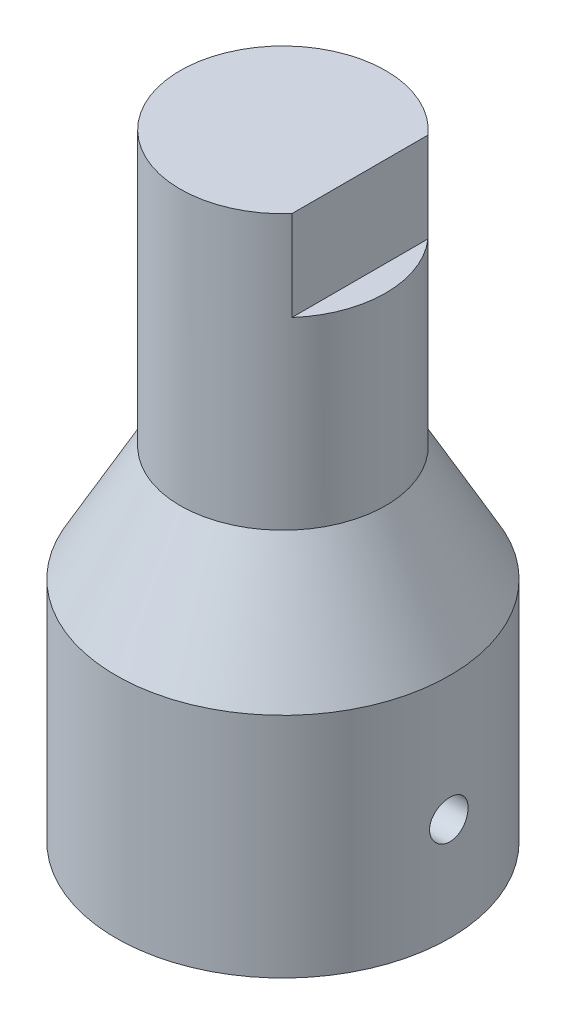
ISO-10303-21;
HEADER;
FILE_DESCRIPTION(('STEP AP214'),'2;1');
FILE_NAME('part.step','',(''),(''),'','','');
FILE_SCHEMA(('AUTOMOTIVE_DESIGN { 1 0 10303 214 1 1 1 1 }'));
ENDSEC;
DATA;
#1=APPLICATION_CONTEXT('core data for automotive mechanical design processes');
#2=APPLICATION_PROTOCOL_DEFINITION('international standard','automotive_design',2000,#1);
#3=PRODUCT_CONTEXT('',#1,'mechanical');
#4=PRODUCT('Part','Part','',(#3));
#5=PRODUCT_RELATED_PRODUCT_CATEGORY('part','',(#4));
#6=PRODUCT_DEFINITION_FORMATION('','',#4);
#7=PRODUCT_DEFINITION_CONTEXT('part definition',#1,'design');
#8=PRODUCT_DEFINITION('design','',#6,#7);
#9=PRODUCT_DEFINITION_SHAPE('','',#8);
#10=(LENGTH_UNIT() NAMED_UNIT(*) SI_UNIT(.MILLI.,.METRE.));
#11=(NAMED_UNIT(*) PLANE_ANGLE_UNIT() SI_UNIT($,.RADIAN.));
#12=(NAMED_UNIT(*) SI_UNIT($,.STERADIAN.) SOLID_ANGLE_UNIT());
#13=UNCERTAINTY_MEASURE_WITH_UNIT(LENGTH_MEASURE(1.E-05),#10,'distance_accuracy_value','');
#14=(GEOMETRIC_REPRESENTATION_CONTEXT(3) GLOBAL_UNCERTAINTY_ASSIGNED_CONTEXT((#13)) GLOBAL_UNIT_ASSIGNED_CONTEXT((#10,
#11,#12)) REPRESENTATION_CONTEXT('',''));
#15=CARTESIAN_POINT('',(0.,0.,0.));
#16=DIRECTION('',(0.,0.,1.));
#17=DIRECTION('',(1.,0.,0.));
#18=AXIS2_PLACEMENT_3D('',#15,#16,#17);
#19=CARTESIAN_POINT('',(0.,38.1,0.));
#20=DIRECTION('',(0.,1.,0.));
#21=DIRECTION('',(0.,0.,1.));
#22=AXIS2_PLACEMENT_3D('',#19,#20,#21);
#23=PLANE('',#22);
#24=CARTESIAN_POINT('',(0.,38.1,0.));
#25=DIRECTION('',(0.,-1.,0.));
#26=DIRECTION('',(0.,0.,-1.));
#27=AXIS2_PLACEMENT_3D('',#24,#25,#26);
#28=CIRCLE('',#27,6.35);
#29=CARTESIAN_POINT('',(4.76,38.1,4.20296324038173));
#30=VERTEX_POINT('',#29);
#31=CARTESIAN_POINT('',(4.76,38.1,-4.20296324038173));
#32=VERTEX_POINT('',#31);
#33=EDGE_CURVE('E48',#30,#32,#28,.T.);
#34=ORIENTED_EDGE('',*,*,#33,.F.);
#35=DIRECTION('',(0.,0.,-1.));
#36=VECTOR('',#35,1.);
#37=CARTESIAN_POINT('',(4.76,38.1,-4.20296324038173));
#38=LINE('',#37,#36);
#39=EDGE_CURVE('E61',#30,#32,#38,.T.);
#40=ORIENTED_EDGE('',*,*,#39,.T.);
#41=EDGE_LOOP('',(#34,#40));
#42=FACE_BOUND('',#41,.T.);
#43=ADVANCED_FACE('F34',(#42),#23,.T.);
#44=CARTESIAN_POINT('',(0.,0.,0.));
#45=DIRECTION('',(0.,-1.,0.));
#46=DIRECTION('',(0.,0.,-1.));
#47=AXIS2_PLACEMENT_3D('',#44,#45,#46);
#48=CYLINDRICAL_SURFACE('',#47,6.35);
#49=CARTESIAN_POINT('',(0.,21.16,0.));
#50=DIRECTION('',(0.,-1.,0.));
#51=DIRECTION('',(0.,0.,-1.));
#52=AXIS2_PLACEMENT_3D('',#49,#50,#51);
#53=CIRCLE('',#52,6.35);
#54=CARTESIAN_POINT('',(0.,21.16,-6.35));
#55=VERTEX_POINT('',#54);
#56=EDGE_CURVE('E79',#55,#55,#53,.T.);
#57=ORIENTED_EDGE('',*,*,#56,.F.);
#58=EDGE_LOOP('',(#57));
#59=FACE_BOUND('',#58,.T.);
#60=CARTESIAN_POINT('',(0.,32.54,0.));
#61=DIRECTION('',(0.,1.,0.));
#62=DIRECTION('',(0.,0.,1.));
#63=AXIS2_PLACEMENT_3D('',#60,#61,#62);
#64=CIRCLE('',#63,6.35);
#65=CARTESIAN_POINT('',(4.76,32.54,-4.20296324038172));
#66=VERTEX_POINT('',#65);
#67=CARTESIAN_POINT('',(4.76,32.54,4.20296324038173));
#68=VERTEX_POINT('',#67);
#69=EDGE_CURVE('E12',#66,#68,#64,.F.);
#70=ORIENTED_EDGE('',*,*,#69,.T.);
#71=DIRECTION('',(0.,1.,0.));
#72=VECTOR('',#71,1.);
#73=CARTESIAN_POINT('',(4.76,32.54,4.20296324038173));
#74=LINE('',#73,#72);
#75=EDGE_CURVE('E72',#68,#30,#74,.T.);
#76=ORIENTED_EDGE('',*,*,#75,.T.);
#77=ORIENTED_EDGE('',*,*,#33,.T.);
#78=DIRECTION('',(0.,1.,0.));
#79=VECTOR('',#78,1.);
#80=CARTESIAN_POINT('',(4.76,32.54,-4.20296324038173));
#81=LINE('',#80,#79);
#82=EDGE_CURVE('E67',#66,#32,#81,.T.);
#83=ORIENTED_EDGE('',*,*,#82,.F.);
#84=EDGE_LOOP('',(#70,#76,#77,#83));
#85=FACE_BOUND('',#84,.T.);
#86=ADVANCED_FACE('F78',(#59,#85),#48,.T.);
#87=CARTESIAN_POINT('',(10.32,0.,0.));
#88=DIRECTION('',(0.,-1.,0.));
#89=DIRECTION('',(0.,0.,-1.));
#90=AXIS2_PLACEMENT_3D('',#87,#88,#89);
#91=PLANE('',#90);
#92=CARTESIAN_POINT('',(0.,0.,0.));
#93=DIRECTION('',(0.,-1.,0.));
#94=DIRECTION('',(0.,0.,-1.));
#95=AXIS2_PLACEMENT_3D('',#92,#93,#94);
#96=CIRCLE('',#95,4.765);
#97=CARTESIAN_POINT('',(0.,0.,-4.765));
#98=VERTEX_POINT('',#97);
#99=EDGE_CURVE('E218',#98,#98,#96,.T.);
#100=ORIENTED_EDGE('',*,*,#99,.F.);
#101=EDGE_LOOP('',(#100));
#102=FACE_BOUND('',#101,.T.);
#103=CARTESIAN_POINT('',(0.,0.,0.));
#104=DIRECTION('',(0.,-1.,0.));
#105=DIRECTION('',(0.,0.,-1.));
#106=AXIS2_PLACEMENT_3D('',#103,#104,#105);
#107=CIRCLE('',#106,10.32);
#108=CARTESIAN_POINT('',(0.,0.,-10.32));
#109=VERTEX_POINT('',#108);
#110=EDGE_CURVE('E71',#109,#109,#107,.T.);
#111=ORIENTED_EDGE('',*,*,#110,.T.);
#112=EDGE_LOOP('',(#111));
#113=FACE_BOUND('',#112,.T.);
#114=ADVANCED_FACE('F36',(#102,#113),#91,.T.);
#115=CARTESIAN_POINT('',(0.,14.06,0.));
#116=DIRECTION('',(0.,-1.,0.));
#117=DIRECTION('',(0.,0.,-1.));
#118=AXIS2_PLACEMENT_3D('',#115,#116,#117);
#119=CONICAL_SURFACE('',#118,10.32,0.509844766144973);
#120=ORIENTED_EDGE('',*,*,#56,.T.);
#121=EDGE_LOOP('',(#120));
#122=FACE_BOUND('',#121,.T.);
#123=CARTESIAN_POINT('',(0.,14.06,0.));
#124=DIRECTION('',(0.,-1.,0.));
#125=DIRECTION('',(0.,0.,-1.));
#126=AXIS2_PLACEMENT_3D('',#123,#124,#125);
#127=CIRCLE('',#126,10.32);
#128=CARTESIAN_POINT('',(0.,14.06,-10.32));
#129=VERTEX_POINT('',#128);
#130=EDGE_CURVE('E82',#129,#129,#127,.T.);
#131=ORIENTED_EDGE('',*,*,#130,.F.);
#132=EDGE_LOOP('',(#131));
#133=FACE_BOUND('',#132,.T.);
#134=ADVANCED_FACE('F122',(#122,#133),#119,.T.);
#135=CARTESIAN_POINT('',(0.,0.,0.));
#136=DIRECTION('',(0.,-1.,0.));
#137=DIRECTION('',(0.,0.,-1.));
#138=AXIS2_PLACEMENT_3D('',#135,#136,#137);
#139=CYLINDRICAL_SURFACE('',#138,10.32);
#140=CARTESIAN_POINT('',(-10.32,5.16,0.));
#141=CARTESIAN_POINT('',(-10.3199991313398,5.16000285367061,0.0666056481815185));
#142=CARTESIAN_POINT('',(-10.3193483598393,5.16561083392538,0.133253918411025));
#143=CARTESIAN_POINT('',(-10.3168148916668,5.18789524285794,0.264698695683967));
#144=CARTESIAN_POINT('',(-10.3149308793368,5.2045834925682,0.329493147882709));
#145=CARTESIAN_POINT('',(-10.3101433505458,5.24853266718858,0.455308108727714));
#146=CARTESIAN_POINT('',(-10.3072404914031,5.27578677662023,0.516331020835482));
#147=CARTESIAN_POINT('',(-10.3007388412731,5.3400797877508,0.632924312978722));
#148=CARTESIAN_POINT('',(-10.2971401775246,5.37711690092585,0.688495687117527));
#149=CARTESIAN_POINT('',(-10.2896302699636,5.46011165676216,0.792882937595045));
#150=CARTESIAN_POINT('',(-10.2857177749769,5.5061061677646,0.841669414042582));
#151=CARTESIAN_POINT('',(-10.2780313604317,5.60563110236265,0.930848992327488));
#152=CARTESIAN_POINT('',(-10.2742574476641,5.65916189463219,0.971241683302424));
#153=CARTESIAN_POINT('',(-10.2672630299805,5.77242826236254,1.04259458230843));
#154=CARTESIAN_POINT('',(-10.2640441315679,5.83218107266927,1.07352760257359));
#155=CARTESIAN_POINT('',(-10.2585403648327,5.95607641629417,1.12490947717023));
#156=CARTESIAN_POINT('',(-10.2562554662366,6.02021880725551,1.14535867131625));
#157=CARTESIAN_POINT('',(-10.2528901395632,6.15076929677871,1.17510389110254));
#158=CARTESIAN_POINT('',(-10.2518043860231,6.21716601684784,1.18444924360488));
#159=CARTESIAN_POINT('',(-10.2509439057284,6.35059365022696,1.19187407075443));
#160=CARTESIAN_POINT('',(-10.251169133832,6.41762454162081,1.18995393331293));
#161=CARTESIAN_POINT('',(-10.2529002976674,6.55007554534576,1.17494284355246));
#162=CARTESIAN_POINT('',(-10.2544000266569,6.61550188573889,1.16190602774103));
#163=CARTESIAN_POINT('',(-10.2585015273025,6.74323186602932,1.12511601943947));
#164=CARTESIAN_POINT('',(-10.2611033182297,6.80553545129994,1.101362639556));
#165=CARTESIAN_POINT('',(-10.2671228729818,6.92542070593236,1.04375493930716));
#166=CARTESIAN_POINT('',(-10.2705425498597,6.98299087303313,1.00987689005223));
#167=CARTESIAN_POINT('',(-10.2778110364573,7.09164911804345,0.932998529258388));
#168=CARTESIAN_POINT('',(-10.2816598628854,7.14273694340636,0.88999786248418));
#169=CARTESIAN_POINT('',(-10.2893806100024,7.23729468517017,0.795793903192672));
#170=CARTESIAN_POINT('',(-10.2932525335411,7.2807180888299,0.744543909878553));
#171=CARTESIAN_POINT('',(-10.3005619803501,7.35835288218946,0.635457455827425));
#172=CARTESIAN_POINT('',(-10.3039995028558,7.39256425567596,0.577620983498356));
#173=CARTESIAN_POINT('',(-10.3100545287775,7.45080309998294,0.456968973382947));
#174=CARTESIAN_POINT('',(-10.3126718160516,7.47482788710208,0.39415212866292));
#175=CARTESIAN_POINT('',(-10.3167894291176,7.51197583537037,0.265339141119329));
#176=CARTESIAN_POINT('',(-10.3182897993697,7.5250994304563,0.199343124957668));
#177=CARTESIAN_POINT('',(-10.3199987788707,7.54001270859701,0.0664476087480356));
#178=CARTESIAN_POINT('',(-10.3202146958008,7.54186651056948,-0.000444605815604968));
#179=CARTESIAN_POINT('',(-10.3193501154185,7.53435645803271,-0.133586746830265));
#180=CARTESIAN_POINT('',(-10.3182696415187,7.52499280610836,-0.199836684858882));
#181=CARTESIAN_POINT('',(-10.3149382786708,7.4953668843367,-0.329626193559137));
#182=CARTESIAN_POINT('',(-10.3126906491222,7.47513495983776,-0.39317278166137));
#183=CARTESIAN_POINT('',(-10.3072768131512,7.42437820086468,-0.515970692118475));
#184=CARTESIAN_POINT('',(-10.3041105798346,7.39385306502929,-0.575221888652565));
#185=CARTESIAN_POINT('',(-10.2971947751659,7.32321964415988,-0.688034922961471));
#186=CARTESIAN_POINT('',(-10.293442688223,7.28306961315961,-0.741570466356875));
#187=CARTESIAN_POINT('',(-10.2857834071337,7.19438550052609,-0.841165556753548));
#188=CARTESIAN_POINT('',(-10.2818762077797,7.14585113722133,-0.887224852489536));
#189=CARTESIAN_POINT('',(-10.2743247466966,7.04149471750531,-0.970785483631036));
#190=CARTESIAN_POINT('',(-10.2706818434965,6.98563865300147,-1.00824448774418));
#191=CARTESIAN_POINT('',(-10.2640931328964,6.86839051744647,-1.07324936854361));
#192=CARTESIAN_POINT('',(-10.2611473133132,6.80699854317572,-1.10079541848908));
#193=CARTESIAN_POINT('',(-10.2562952817425,6.68056140941739,-1.14512295606259));
#194=CARTESIAN_POINT('',(-10.2543867136927,6.61552490243566,-1.16192885479695));
#195=CARTESIAN_POINT('',(-10.2518183133155,6.48352973160394,-1.18437790244553));
#196=CARTESIAN_POINT('',(-10.2511584321981,6.41657114295949,-1.19002148750665));
#197=CARTESIAN_POINT('',(-10.2511633873516,6.28305346690789,-1.18997851494019));
#198=CARTESIAN_POINT('',(-10.251820448781,6.21649434793949,-1.18435845457409));
#199=CARTESIAN_POINT('',(-10.254368597572,6.08527305978042,-1.1620879655358));
#200=CARTESIAN_POINT('',(-10.2562596856389,6.02061089167398,-1.14543753055916));
#201=CARTESIAN_POINT('',(-10.2610605091339,5.89502441435459,-1.10159874574058));
#202=CARTESIAN_POINT('',(-10.2639699839487,5.83409915352095,-1.07441309175403));
#203=CARTESIAN_POINT('',(-10.2704802305922,5.71766497922671,-1.0102821840977));
#204=CARTESIAN_POINT('',(-10.2740810059447,5.66215609337784,-0.973336880678478));
#205=CARTESIAN_POINT('',(-10.2815936262646,5.5577899454698,-0.890487256717729));
#206=CARTESIAN_POINT('',(-10.2855071189199,5.50897217415925,-0.844533336279079));
#207=CARTESIAN_POINT('',(-10.2931894364098,5.41971421194748,-0.745072929817184));
#208=CARTESIAN_POINT('',(-10.2969582267056,5.37927601114377,-0.691564654741717));
#209=CARTESIAN_POINT('',(-10.3039397993136,5.30781576493335,-0.578317442041716));
#210=CARTESIAN_POINT('',(-10.3071507294342,5.27682483848988,-0.518558765657484));
#211=CARTESIAN_POINT('',(-10.3126355939071,5.22536079256566,-0.394683817505039));
#212=CARTESIAN_POINT('',(-10.3149105617648,5.20487606576145,-0.330572443723727));
#213=CARTESIAN_POINT('',(-10.3177091065175,5.17999439804737,-0.221763350536908));
#214=CARTESIAN_POINT('',(-10.3185640810139,5.172507052419,-0.177755909431089));
#215=CARTESIAN_POINT('',(-10.319709816884,5.16250891284002,-0.0891720123393319));
#216=CARTESIAN_POINT('',(-10.3200005816082,5.15999808933564,-0.0445955597341317));
#217=CARTESIAN_POINT('',(-10.32,5.16,0.));
#218=B_SPLINE_CURVE_WITH_KNOTS('',3,(#140,#141,#142,#143,#144,#145,#146,#147,#148,#149,#150,
#151,#152,#153,#154,#155,#156,#157,#158,#159,#160,#161,#162,#163,#164,#165,#166,#167,#168,#169,
#170,#171,#172,#173,#174,#175,#176,#177,#178,#179,#180,#181,#182,#183,#184,#185,#186,#187,#188,
#189,#190,#191,#192,#193,#194,#195,#196,#197,#198,#199,#200,#201,#202,#203,#204,#205,#206,#207,
#208,#209,#210,#211,#212,#213,#214,#215,#216,#217),.UNSPECIFIED.,.T.,.F.,(4,2,2,2,2,2,2,2,2,2,2,
2,2,2,2,2,2,2,2,2,2,2,2,2,2,2,2,2,2,2,2,2,2,2,2,2,2,2,4),(0.,0.199654070998725,
0.399521486780826,0.599260192580326,0.798962407493017,0.999504657997326,1.20005672241448,
1.40117988491314,1.60229652795057,1.80251636495611,2.00272930771384,2.20197277638137,
2.40121972922051,2.60093736299026,2.80066277520497,3.00156143320588,3.20246044478952,
3.4034123512713,3.60435625820545,3.80415582684177,4.00395178719381,4.20319277410583,
4.40243959483661,4.60256676128992,4.80270065232008,5.00379945227941,5.20489473725144,
5.40553131517036,5.60616005342903,5.80560782745987,6.00505571548596,6.20445260049047,
6.40385050193243,6.60437875647934,6.8049545808339,7.00618412770539,7.20719087323963,
7.34086929494626,7.47454692278228),.UNSPECIFIED.);
#219=CARTESIAN_POINT('',(-10.32,5.16,0.));
#220=VERTEX_POINT('',#219);
#221=EDGE_CURVE('E111',#220,#220,#218,.T.);
#222=ORIENTED_EDGE('',*,*,#221,.F.);
#223=EDGE_LOOP('',(#222));
#224=FACE_BOUND('',#223,.T.);
#225=CARTESIAN_POINT('',(10.2511609098677,6.35,-1.19));
#226=CARTESIAN_POINT('',(10.2511618003147,6.4166039884974,-1.18999714485913));
#227=CARTESIAN_POINT('',(10.2518170239064,6.48325060405697,-1.1843894346432));
#228=CARTESIAN_POINT('',(10.2543663920724,6.61469194355725,-1.1621061957766));
#229=CARTESIAN_POINT('',(10.2562618605002,6.67948461134944,-1.14541884028889));
#230=CARTESIAN_POINT('',(10.2610742309923,6.80529579835843,-1.10147228134853));
#231=CARTESIAN_POINT('',(10.2639904703364,6.86631673614424,-1.07421993582632));
#232=CARTESIAN_POINT('',(10.2705149911889,6.98290671768564,-1.00993107908933));
#233=CARTESIAN_POINT('',(10.2741231464652,7.03847675310551,-0.97289635209438));
#234=CARTESIAN_POINT('',(10.2816442874139,7.1428655049822,-0.889904010972393));
#235=CARTESIAN_POINT('',(10.2855585081724,7.19165439994831,-0.843908995004535));
#236=CARTESIAN_POINT('',(10.2932396008387,7.28083864895662,-0.744382033619051));
#237=CARTESIAN_POINT('',(10.2970064656571,7.321233599559,-0.690849726142439));
#238=CARTESIAN_POINT('',(10.3039809111956,7.39258886958493,-0.577582020631669));
#239=CARTESIAN_POINT('',(10.3071868939045,7.42352241400472,-0.517829648377619));
#240=CARTESIAN_POINT('',(10.3126648213566,7.47490537834824,-0.393935256536553));
#241=CARTESIAN_POINT('',(10.3149367958273,7.49535513195267,-0.329793376733537));
#242=CARTESIAN_POINT('',(10.3182820280996,7.52510150878181,-0.1992444936297));
#243=CARTESIAN_POINT('',(10.319360591676,7.53444751186677,-0.132848879961245));
#244=CARTESIAN_POINT('',(10.3202155677277,7.54187402356371,0.000576584039608928));
#245=CARTESIAN_POINT('',(10.3199920242162,7.53995491295509,0.0676064128580279));
#246=CARTESIAN_POINT('',(10.3182722861494,7.52494545698029,0.200061923371934));
#247=CARTESIAN_POINT('',(10.3167821412645,7.51190821419114,0.265493712052312));
#248=CARTESIAN_POINT('',(10.3127034877316,7.47511546656623,0.393234368161895));
#249=CARTESIAN_POINT('',(10.3101149608768,7.45135978406155,0.455543183805656));
#250=CARTESIAN_POINT('',(10.3041200337616,7.39374729958791,0.575434810063759));
#251=CARTESIAN_POINT('',(10.3007117590298,7.35986730323692,0.633006377363564));
#252=CARTESIAN_POINT('',(10.2934591204028,7.28298477788841,0.741666598618616));
#253=CARTESIAN_POINT('',(10.2896147394864,7.23998189276805,0.792754999371276));
#254=CARTESIAN_POINT('',(10.2818942192679,7.14577634993999,0.887310265597073));
#255=CARTESIAN_POINT('',(10.2780180253155,7.09452744686789,0.930731065338613));
#256=CARTESIAN_POINT('',(10.2706929193936,6.98544410547881,1.00836112295829));
#257=CARTESIAN_POINT('',(10.2672440084293,6.92760965166787,1.04257035916357));
#258=CARTESIAN_POINT('',(10.2611638855462,6.80695820922884,1.10080766197985));
#259=CARTESIAN_POINT('',(10.258532941957,6.74413959403943,1.12483238855752));
#260=CARTESIAN_POINT('',(10.2543920224965,6.6153227550547,1.16197967415371));
#261=CARTESIAN_POINT('',(10.2528820008902,6.5493246611032,1.17510267797901));
#262=CARTESIAN_POINT('',(10.2511620977108,6.41642814542983,1.19001372354597));
#263=CARTESIAN_POINT('',(10.2509447985322,6.34953707195416,1.19186643529805));
#264=CARTESIAN_POINT('',(10.2518153462573,6.21639747425019,1.1843546095762));
#265=CARTESIAN_POINT('',(10.2529031695786,6.15014893843359,1.17499027478474));
#266=CARTESIAN_POINT('',(10.2562546338735,6.02036657269734,1.14536448476335));
#267=CARTESIAN_POINT('',(10.2585149282311,5.9568255702752,1.12513403917344));
#268=CARTESIAN_POINT('',(10.2639539468847,5.83403817772421,1.07438210655474));
#269=CARTESIAN_POINT('',(10.2671326988573,5.7747919170791,1.04386030940488));
#270=CARTESIAN_POINT('',(10.2740683193984,5.66198229970662,0.973231832855455));
#271=CARTESIAN_POINT('',(10.2778277298146,5.60844576887392,0.933082560044963));
#272=CARTESIAN_POINT('',(10.2854929641029,5.50884833352347,0.8443993784602));
#273=CARTESIAN_POINT('',(10.2893987928049,5.46278767587204,0.795865192910748));
#274=CARTESIAN_POINT('',(10.2969394059179,5.37922402478929,0.69150819005669));
#275=CARTESIAN_POINT('',(10.30057279142,5.34176339995147,0.635651330810747));
#276=CARTESIAN_POINT('',(10.3071384554814,5.27675567675493,0.518401166250591));
#277=CARTESIAN_POINT('',(10.3100707463408,5.24920840447016,0.457007958093187));
#278=CARTESIAN_POINT('',(10.3148975826094,5.20488007504477,0.33057154090507));
#279=CARTESIAN_POINT('',(10.3167945305326,5.18807407712266,0.265537171543125));
#280=CARTESIAN_POINT('',(10.3193468774767,5.16562410704516,0.133546515233741));
#281=CARTESIAN_POINT('',(10.3200023237321,5.15997971023112,0.0665903015038781));
#282=CARTESIAN_POINT('',(10.3199976769884,5.16002028272168,-0.0669287076200466));
#283=CARTESIAN_POINT('',(10.3193451909149,5.1656397415084,-0.133491532771196));
#284=CARTESIAN_POINT('',(10.3168130578598,5.18791032970963,-0.26472038533227));
#285=CARTESIAN_POINT('',(10.3149334109001,5.20456145892774,-0.329386412775963));
#286=CARTESIAN_POINT('',(10.3101573323211,5.24840312351417,-0.454980741297567));
#287=CARTESIAN_POINT('',(10.3072611557932,5.27559101492904,-0.51590997559729));
#288=CARTESIAN_POINT('',(10.300773596554,5.33972763005288,-0.63235116545166));
#289=CARTESIAN_POINT('',(10.2971822106163,5.37667639906114,-0.68786309586348));
#290=CARTESIAN_POINT('',(10.2896807621834,5.45952987280103,-0.792229157199262));
#291=CARTESIAN_POINT('',(10.2857690339125,5.50548338229471,-0.841044425265268));
#292=CARTESIAN_POINT('',(10.2780814733617,5.60494193167356,-0.930297528595171));
#293=CARTESIAN_POINT('',(10.2743056736485,5.65844876632237,-0.970733367150746));
#294=CARTESIAN_POINT('',(10.2673041811571,5.77169476766084,-1.04219102655991));
#295=CARTESIAN_POINT('',(10.2640803463452,5.83145393364103,-1.07318131564034));
#296=CARTESIAN_POINT('',(10.2585696714069,5.9553299122063,-1.12464403498731));
#297=CARTESIAN_POINT('',(10.2562817970775,6.01944182329648,-1.14512808066598));
#298=CARTESIAN_POINT('',(10.2534665347319,6.12824910033192,-1.17000786001087));
#299=CARTESIAN_POINT('',(10.2526061405477,6.17225405488664,-1.17749435565192));
#300=CARTESIAN_POINT('',(10.2514530317537,6.26083297253828,-1.18749136630743));
#301=CARTESIAN_POINT('',(10.2511603136908,6.30540693217239,-1.19000191158958));
#302=CARTESIAN_POINT('',(10.2511609098677,6.35,-1.19));
#303=B_SPLINE_CURVE_WITH_KNOTS('',3,(#225,#226,#227,#228,#229,#230,#231,#232,#233,#234,#235,
#236,#237,#238,#239,#240,#241,#242,#243,#244,#245,#246,#247,#248,#249,#250,#251,#252,#253,#254,
#255,#256,#257,#258,#259,#260,#261,#262,#263,#264,#265,#266,#267,#268,#269,#270,#271,#272,#273,
#274,#275,#276,#277,#278,#279,#280,#281,#282,#283,#284,#285,#286,#287,#288,#289,#290,#291,#292,
#293,#294,#295,#296,#297,#298,#299,#300,#301,#302),.UNSPECIFIED.,.T.,.F.,(4,2,2,2,2,2,2,2,2,2,2,
2,2,2,2,2,2,2,2,2,2,2,2,2,2,2,2,2,2,2,2,2,2,2,2,2,2,2,4),(0.,0.199649085310986,
0.399511627049384,0.599244650958121,0.798941270455199,0.999490046087252,1.20004845850651,
1.40116929268152,1.60228372513514,1.80250038652926,2.00271028030941,2.2019692502395,
2.40123152320879,2.60095384390822,2.8006839624414,3.00157597325164,3.20246845671413,
3.40342677245449,3.60437688838863,3.80417283736694,4.00396517625722,4.20319035506742,
4.40242153789433,4.60255096248743,4.80268699435792,5.00378880580786,5.20488708882956,
5.40551671735624,5.60613871250282,5.80559727690768,6.0050558377617,6.20446438153719,
6.40387385076491,6.60439558352586,6.80496504318572,7.00619690349854,7.20720580526068,
7.3408767694068,7.47454692045699),.UNSPECIFIED.);
#304=CARTESIAN_POINT('',(10.2511609098677,6.35,-1.19));
#305=VERTEX_POINT('',#304);
#306=EDGE_CURVE('E105',#305,#305,#303,.T.);
#307=ORIENTED_EDGE('',*,*,#306,.F.);
#308=EDGE_LOOP('',(#307));
#309=FACE_BOUND('',#308,.T.);
#310=ORIENTED_EDGE('',*,*,#130,.T.);
#311=EDGE_LOOP('',(#310));
#312=FACE_BOUND('',#311,.T.);
#313=ORIENTED_EDGE('',*,*,#110,.F.);
#314=EDGE_LOOP('',(#313));
#315=FACE_BOUND('',#314,.T.);
#316=ADVANCED_FACE('F116',(#224,#309,#312,#315),#139,.T.);
#317=CARTESIAN_POINT('',(0.,32.54,0.));
#318=DIRECTION('',(0.,1.,0.));
#319=DIRECTION('',(0.,0.,1.));
#320=AXIS2_PLACEMENT_3D('',#317,#318,#319);
#321=PLANE('',#320);
#322=DIRECTION('',(0.,0.,-1.));
#323=VECTOR('',#322,1.);
#324=CARTESIAN_POINT('',(4.76,32.54,-4.20296324038173));
#325=LINE('',#324,#323);
#326=EDGE_CURVE('E56',#68,#66,#325,.T.);
#327=ORIENTED_EDGE('',*,*,#326,.F.);
#328=ORIENTED_EDGE('',*,*,#69,.F.);
#329=EDGE_LOOP('',(#327,#328));
#330=FACE_BOUND('',#329,.T.);
#331=ADVANCED_FACE('F121',(#330),#321,.T.);
#332=CARTESIAN_POINT('',(4.76,32.54,-4.20296324038173));
#333=DIRECTION('',(1.,0.,0.));
#334=DIRECTION('',(0.,0.,-1.));
#335=AXIS2_PLACEMENT_3D('',#332,#333,#334);
#336=PLANE('',#335);
#337=ORIENTED_EDGE('',*,*,#39,.F.);
#338=ORIENTED_EDGE('',*,*,#75,.F.);
#339=ORIENTED_EDGE('',*,*,#326,.T.);
#340=ORIENTED_EDGE('',*,*,#82,.T.);
#341=EDGE_LOOP('',(#337,#338,#339,#340));
#342=FACE_BOUND('',#341,.T.);
#343=ADVANCED_FACE('F68',(#342),#336,.T.);
#344=CARTESIAN_POINT('',(0.,14.6,0.));
#345=DIRECTION('',(0.,-1.,0.));
#346=DIRECTION('',(0.,0.,-1.));
#347=AXIS2_PLACEMENT_3D('',#344,#345,#346);
#348=CYLINDRICAL_SURFACE('',#347,4.765);
#349=CARTESIAN_POINT('',(-4.61401397917258,6.35,-1.19));
#350=CARTESIAN_POINT('',(-4.61401523497183,6.28428544854267,-1.18999812935116));
#351=CARTESIAN_POINT('',(-4.61543320692624,6.21855018068086,-1.18453809503024));
#352=CARTESIAN_POINT('',(-4.62093743353767,6.08896718497453,-1.16287694856644));
#353=CARTESIAN_POINT('',(-4.62502524440111,6.02512058070374,-1.14666957188514));
#354=CARTESIAN_POINT('',(-4.63537795671999,5.90120801329323,-1.10407087574058));
#355=CARTESIAN_POINT('',(-4.64164005045324,5.84113729181604,-1.07769268534945));
#356=CARTESIAN_POINT('',(-4.65563225406309,5.72626732404759,-1.01554110378477));
#357=CARTESIAN_POINT('',(-4.66336242545803,5.67146829880657,-0.979767318874062));
#358=CARTESIAN_POINT('',(-4.67960982052444,5.56749386316066,-0.89900091806069));
#359=CARTESIAN_POINT('',(-4.68813959736599,5.51845128489636,-0.853839792900786));
#360=CARTESIAN_POINT('',(-4.70491620617414,5.42855204417957,-0.755943630987842));
#361=CARTESIAN_POINT('',(-4.71316301167116,5.38769614580096,-0.703207888073351));
#362=CARTESIAN_POINT('',(-4.72858335132029,5.31478671193595,-0.590749642090559));
#363=CARTESIAN_POINT('',(-4.73574034475527,5.28286364340274,-0.530940089765394));
#364=CARTESIAN_POINT('',(-4.74803146099623,5.22957432059784,-0.40659515713709));
#365=CARTESIAN_POINT('',(-4.75316588159515,5.20820651210764,-0.342060474197736));
#366=CARTESIAN_POINT('',(-4.76074460007261,5.17705966035355,-0.211481925472111));
#367=CARTESIAN_POINT('',(-4.7632411871092,5.16705505404224,-0.145494950436618));
#368=CARTESIAN_POINT('',(-4.76544514600962,5.15821059564685,-0.0127351536993886));
#369=CARTESIAN_POINT('',(-4.76515292941978,5.15936909621304,0.0540375505990582));
#370=CARTESIAN_POINT('',(-4.76185113877077,5.17265568599132,0.184909046171284));
#371=CARTESIAN_POINT('',(-4.75890187933411,5.18454030394747,0.249034306319786));
#372=CARTESIAN_POINT('',(-4.75068760180743,5.21855044682905,0.374349925851456));
#373=CARTESIAN_POINT('',(-4.74542246058953,5.24067651626241,0.43554012899533));
#374=CARTESIAN_POINT('',(-4.73307570849108,5.29473864021747,0.553890418539721));
#375=CARTESIAN_POINT('',(-4.72597813945499,5.32676139140561,0.611009168943075));
#376=CARTESIAN_POINT('',(-4.71073649734112,5.39964211118773,0.719147538356594));
#377=CARTESIAN_POINT('',(-4.70259224263651,5.44050161402711,0.770166095853739));
#378=CARTESIAN_POINT('',(-4.68588524474319,5.53120133081436,0.866107826061178));
#379=CARTESIAN_POINT('',(-4.6773171397213,5.58125429893219,0.910829150435362));
#380=CARTESIAN_POINT('',(-4.6609294406777,5.68823907942064,0.991288302675698));
#381=CARTESIAN_POINT('',(-4.65310988150073,5.74517121173685,1.02702571246732));
#382=CARTESIAN_POINT('',(-4.63908548754474,5.86469356722076,1.0886314651127));
#383=CARTESIAN_POINT('',(-4.63288863436356,5.92730979097634,1.11445130631254));
#384=CARTESIAN_POINT('',(-4.62291375327761,6.0561863160366,1.15513503756016));
#385=CARTESIAN_POINT('',(-4.61913520901468,6.12244583614015,1.17000126652953));
#386=CARTESIAN_POINT('',(-4.61453311355358,6.25485642896814,1.18802106811188));
#387=CARTESIAN_POINT('',(-4.61363429721068,6.32096432359074,1.19147304484411));
#388=CARTESIAN_POINT('',(-4.61468856889717,6.45281169461719,1.18738321379788));
#389=CARTESIAN_POINT('',(-4.61664139501121,6.51855120429949,1.17984241567501));
#390=CARTESIAN_POINT('',(-4.62310680497174,6.6466882360164,1.1542427091293));
#391=CARTESIAN_POINT('',(-4.62757709552251,6.70912278912633,1.13635745620405));
#392=CARTESIAN_POINT('',(-4.63853360882755,6.83010756130263,1.09076903755975));
#393=CARTESIAN_POINT('',(-4.64502006999008,6.88865732000553,1.06306471069991));
#394=CARTESIAN_POINT('',(-4.65943659229557,7.0014750791126,0.997999692784192));
#395=CARTESIAN_POINT('',(-4.66739243301665,7.05563679251974,0.960460546643164));
#396=CARTESIAN_POINT('',(-4.68378800116259,7.15700180057484,0.877017204817689));
#397=CARTESIAN_POINT('',(-4.69222780777786,7.20420395190453,0.831111637459572));
#398=CARTESIAN_POINT('',(-4.70889537260417,7.2915182883212,0.730869241331541));
#399=CARTESIAN_POINT('',(-4.71711257823337,7.33142407338332,0.676350549677062));
#400=CARTESIAN_POINT('',(-4.73219096407644,7.40151405486932,0.56121260701408));
#401=CARTESIAN_POINT('',(-4.73905221497493,7.43169875809562,0.500593674254099));
#402=CARTESIAN_POINT('',(-4.75060239725559,7.48122795742177,0.375394687221681));
#403=CARTESIAN_POINT('',(-4.75530689591925,7.50065035482524,0.310846954988373));
#404=CARTESIAN_POINT('',(-4.76208164554832,7.52833754717776,0.179270738102418));
#405=CARTESIAN_POINT('',(-4.7641524037527,7.53660449060355,0.112242733691673));
#406=CARTESIAN_POINT('',(-4.76540570079363,7.54162546617117,-0.0204521308015899));
#407=CARTESIAN_POINT('',(-4.76466466442947,7.53868413082176,-0.0861069170161551));
#408=CARTESIAN_POINT('',(-4.76054706113858,7.52206965066218,-0.215955300455856));
#409=CARTESIAN_POINT('',(-4.75717057229273,7.50839682379523,-0.280148940912557));
#410=CARTESIAN_POINT('',(-4.74817321306777,7.47087071577556,-0.404934698850075));
#411=CARTESIAN_POINT('',(-4.74256447369784,7.44707241332445,-0.465544281498075));
#412=CARTESIAN_POINT('',(-4.72969330649769,7.39002081179419,-0.58194440460134));
#413=CARTESIAN_POINT('',(-4.72243067061316,7.35676632302945,-0.637734337542841));
#414=CARTESIAN_POINT('',(-4.70681783049742,7.2808166841373,-0.744356282608651));
#415=CARTESIAN_POINT('',(-4.69844577099131,7.23791478210523,-0.795037820572039));
#416=CARTESIAN_POINT('',(-4.68165614210748,7.14428969355339,-0.888585683219114));
#417=CARTESIAN_POINT('',(-4.67323856173623,7.09356452807967,-0.931450024479248));
#418=CARTESIAN_POINT('',(-4.65713268448935,6.98459671913665,-1.00892960122247));
#419=CARTESIAN_POINT('',(-4.64946087110168,6.92623176343786,-1.04337651101762));
#420=CARTESIAN_POINT('',(-4.6359368706037,6.8043560372888,-1.10191805929683));
#421=CARTESIAN_POINT('',(-4.6300833584825,6.74084905661909,-1.12602024098004));
#422=CARTESIAN_POINT('',(-4.62177503091177,6.62287684948427,-1.15959363633471));
#423=CARTESIAN_POINT('',(-4.61888651590035,6.56897682431081,-1.17097119352554));
#424=CARTESIAN_POINT('',(-4.61500554466779,6.46005597913214,-1.18617483808746));
#425=CARTESIAN_POINT('',(-4.61401292745375,6.40503525469376,-1.19000156664899));
#426=CARTESIAN_POINT('',(-4.61401397917258,6.35,-1.19));
#427=B_SPLINE_CURVE_WITH_KNOTS('',3,(#349,#350,#351,#352,#353,#354,#355,#356,#357,#358,#359,
#360,#361,#362,#363,#364,#365,#366,#367,#368,#369,#370,#371,#372,#373,#374,#375,#376,#377,#378,
#379,#380,#381,#382,#383,#384,#385,#386,#387,#388,#389,#390,#391,#392,#393,#394,#395,#396,#397,
#398,#399,#400,#401,#402,#403,#404,#405,#406,#407,#408,#409,#410,#411,#412,#413,#414,#415,#416,
#417,#418,#419,#420,#421,#422,#423,#424,#425,#426),.UNSPECIFIED.,.T.,.F.,(4,2,2,2,2,2,2,2,2,2,2,
2,2,2,2,2,2,2,2,2,2,2,2,2,2,2,2,2,2,2,2,2,2,2,2,2,2,2,4),(0.,0.196941551124805,
0.393997998904301,0.590800921901019,0.787612093549613,0.988320155613463,1.1890469413153,
1.39256827928652,1.59605964064052,1.7954368922362,1.994784722002,2.18971832716193,
2.38466229756016,2.581364886019,2.77810165362852,2.98015210150535,3.18221195024119,
3.38524775489378,3.58824019279664,3.78588196751864,3.98350559054062,4.17790415202952,
4.37232570952148,4.57055414679315,4.76881511287493,4.97202524882259,5.17522478882329,
5.37693361808434,5.57860359382921,5.77483193342573,5.97105445956071,6.16622487855652,
6.36141986287254,6.56128287644833,6.76119653006516,6.96482985651416,7.1683144437049,
7.33326495604852,7.49820146075821),.UNSPECIFIED.);
#428=CARTESIAN_POINT('',(-4.61401397917258,6.35,-1.19));
#429=VERTEX_POINT('',#428);
#430=EDGE_CURVE('E38',#429,#429,#427,.T.);
#431=ORIENTED_EDGE('',*,*,#430,.T.);
#432=EDGE_LOOP('',(#431));
#433=FACE_BOUND('',#432,.T.);
#434=CARTESIAN_POINT('',(4.61401397917258,6.35,-1.19));
#435=CARTESIAN_POINT('',(4.61401523497183,6.41571455145733,-1.18999812935116));
#436=CARTESIAN_POINT('',(4.61543320692624,6.48144981931914,-1.18453809503024));
#437=CARTESIAN_POINT('',(4.62093743353767,6.61103281502547,-1.16287694856644));
#438=CARTESIAN_POINT('',(4.62502524440111,6.67487941929626,-1.14666957188514));
#439=CARTESIAN_POINT('',(4.63537795671999,6.79879198670677,-1.10407087574058));
#440=CARTESIAN_POINT('',(4.64164005045324,6.85886270818396,-1.07769268534945));
#441=CARTESIAN_POINT('',(4.65563225406309,6.97373267595241,-1.01554110378477));
#442=CARTESIAN_POINT('',(4.66336242545803,7.02853170119343,-0.979767318874061));
#443=CARTESIAN_POINT('',(4.67960982052444,7.13250613683934,-0.89900091806069));
#444=CARTESIAN_POINT('',(4.68813959736599,7.18154871510364,-0.853839792900786));
#445=CARTESIAN_POINT('',(4.70491620617414,7.27144795582043,-0.755943630987842));
#446=CARTESIAN_POINT('',(4.71316301167116,7.31230385419904,-0.703207888073351));
#447=CARTESIAN_POINT('',(4.72858335132029,7.38521328806405,-0.590749642090559));
#448=CARTESIAN_POINT('',(4.73574034475527,7.41713635659726,-0.530940089765394));
#449=CARTESIAN_POINT('',(4.74803146099623,7.47042567940216,-0.40659515713709));
#450=CARTESIAN_POINT('',(4.75316588159515,7.49179348789236,-0.342060474197736));
#451=CARTESIAN_POINT('',(4.76074460007261,7.52294033964645,-0.211481925472111));
#452=CARTESIAN_POINT('',(4.7632411871092,7.53294494595776,-0.145494950436618));
#453=CARTESIAN_POINT('',(4.76544514600962,7.54178940435315,-0.0127351536993886));
#454=CARTESIAN_POINT('',(4.76515292941978,7.54063090378696,0.0540375505990582));
#455=CARTESIAN_POINT('',(4.76185113877077,7.52734431400868,0.184909046171284));
#456=CARTESIAN_POINT('',(4.75890187933411,7.51545969605253,0.249034306319786));
#457=CARTESIAN_POINT('',(4.75068760180743,7.48144955317095,0.374349925851455));
#458=CARTESIAN_POINT('',(4.74542246058953,7.45932348373759,0.43554012899533));
#459=CARTESIAN_POINT('',(4.73307570849108,7.40526135978253,0.553890418539721));
#460=CARTESIAN_POINT('',(4.72597813945499,7.37323860859439,0.611009168943075));
#461=CARTESIAN_POINT('',(4.71073649734112,7.30035788881227,0.719147538356594));
#462=CARTESIAN_POINT('',(4.70259224263651,7.25949838597289,0.770166095853739));
#463=CARTESIAN_POINT('',(4.68588524474319,7.16879866918564,0.866107826061178));
#464=CARTESIAN_POINT('',(4.6773171397213,7.11874570106781,0.910829150435362));
#465=CARTESIAN_POINT('',(4.6609294406777,7.01176092057936,0.991288302675698));
#466=CARTESIAN_POINT('',(4.65310988150073,6.95482878826315,1.02702571246732));
#467=CARTESIAN_POINT('',(4.63908548754474,6.83530643277924,1.0886314651127));
#468=CARTESIAN_POINT('',(4.63288863436356,6.77269020902366,1.11445130631254));
#469=CARTESIAN_POINT('',(4.62291375327761,6.6438136839634,1.15513503756016));
#470=CARTESIAN_POINT('',(4.61913520901468,6.57755416385984,1.17000126652953));
#471=CARTESIAN_POINT('',(4.61453311355358,6.44514357103186,1.18802106811188));
#472=CARTESIAN_POINT('',(4.61363429721068,6.37903567640926,1.19147304484411));
#473=CARTESIAN_POINT('',(4.61468856889717,6.24718830538281,1.18738321379788));
#474=CARTESIAN_POINT('',(4.61664139501121,6.18144879570051,1.17984241567501));
#475=CARTESIAN_POINT('',(4.62310680497174,6.0533117639836,1.1542427091293));
#476=CARTESIAN_POINT('',(4.62757709552251,5.99087721087367,1.13635745620405));
#477=CARTESIAN_POINT('',(4.63853360882755,5.86989243869737,1.09076903755975));
#478=CARTESIAN_POINT('',(4.64502006999008,5.81134267999447,1.06306471069991));
#479=CARTESIAN_POINT('',(4.65943659229557,5.6985249208874,0.997999692784192));
#480=CARTESIAN_POINT('',(4.66739243301665,5.64436320748026,0.960460546643164));
#481=CARTESIAN_POINT('',(4.68378800116259,5.54299819942516,0.877017204817689));
#482=CARTESIAN_POINT('',(4.69222780777786,5.49579604809547,0.831111637459572));
#483=CARTESIAN_POINT('',(4.70889537260417,5.4084817116788,0.730869241331541));
#484=CARTESIAN_POINT('',(4.71711257823337,5.36857592661668,0.676350549677062));
#485=CARTESIAN_POINT('',(4.73219096407644,5.29848594513068,0.56121260701408));
#486=CARTESIAN_POINT('',(4.73905221497493,5.26830124190438,0.500593674254099));
#487=CARTESIAN_POINT('',(4.75060239725559,5.21877204257822,0.375394687221681));
#488=CARTESIAN_POINT('',(4.75530689591925,5.19934964517476,0.310846954988373));
#489=CARTESIAN_POINT('',(4.76208164554832,5.17166245282224,0.179270738102418));
#490=CARTESIAN_POINT('',(4.7641524037527,5.16339550939645,0.112242733691673));
#491=CARTESIAN_POINT('',(4.76540570079363,5.15837453382883,-0.0204521308015899));
#492=CARTESIAN_POINT('',(4.76466466442947,5.16131586917824,-0.0861069170161551));
#493=CARTESIAN_POINT('',(4.76054706113858,5.17793034933782,-0.215955300455856));
#494=CARTESIAN_POINT('',(4.75717057229273,5.19160317620477,-0.280148940912557));
#495=CARTESIAN_POINT('',(4.74817321306777,5.22912928422443,-0.404934698850075));
#496=CARTESIAN_POINT('',(4.74256447369784,5.25292758667555,-0.465544281498076));
#497=CARTESIAN_POINT('',(4.72969330649769,5.30997918820581,-0.58194440460134));
#498=CARTESIAN_POINT('',(4.72243067061316,5.34323367697055,-0.637734337542841));
#499=CARTESIAN_POINT('',(4.70681783049742,5.4191833158627,-0.744356282608651));
#500=CARTESIAN_POINT('',(4.69844577099131,5.46208521789477,-0.795037820572039));
#501=CARTESIAN_POINT('',(4.68165614210748,5.55571030644661,-0.888585683219114));
#502=CARTESIAN_POINT('',(4.67323856173623,5.60643547192033,-0.931450024479248));
#503=CARTESIAN_POINT('',(4.65713268448935,5.71540328086335,-1.00892960122247));
#504=CARTESIAN_POINT('',(4.64946087110168,5.77376823656214,-1.04337651101762));
#505=CARTESIAN_POINT('',(4.6359368706037,5.89564396271119,-1.10191805929683));
#506=CARTESIAN_POINT('',(4.6300833584825,5.95915094338091,-1.12602024098004));
#507=CARTESIAN_POINT('',(4.62177503091177,6.07712315051573,-1.15959363633471));
#508=CARTESIAN_POINT('',(4.61888651590035,6.13102317568919,-1.17097119352554));
#509=CARTESIAN_POINT('',(4.61500554466779,6.23994402086786,-1.18617483808746));
#510=CARTESIAN_POINT('',(4.61401292745375,6.29496474530624,-1.19000156664899));
#511=CARTESIAN_POINT('',(4.61401397917258,6.35,-1.19));
#512=B_SPLINE_CURVE_WITH_KNOTS('',3,(#434,#435,#436,#437,#438,#439,#440,#441,#442,#443,#444,
#445,#446,#447,#448,#449,#450,#451,#452,#453,#454,#455,#456,#457,#458,#459,#460,#461,#462,#463,
#464,#465,#466,#467,#468,#469,#470,#471,#472,#473,#474,#475,#476,#477,#478,#479,#480,#481,#482,
#483,#484,#485,#486,#487,#488,#489,#490,#491,#492,#493,#494,#495,#496,#497,#498,#499,#500,#501,
#502,#503,#504,#505,#506,#507,#508,#509,#510,#511),.UNSPECIFIED.,.T.,.F.,(4,2,2,2,2,2,2,2,2,2,2,
2,2,2,2,2,2,2,2,2,2,2,2,2,2,2,2,2,2,2,2,2,2,2,2,2,2,2,4),(0.,0.196941551124805,
0.393997998904301,0.590800921901019,0.787612093549612,0.988320155613463,1.1890469413153,
1.39256827928652,1.59605964064052,1.7954368922362,1.994784722002,2.18971832716193,
2.38466229756016,2.581364886019,2.77810165362852,2.98015210150535,3.18221195024119,
3.38524775489378,3.58824019279664,3.78588196751864,3.98350559054062,4.17790415202952,
4.37232570952148,4.57055414679315,4.76881511287493,4.97202524882259,5.17522478882329,
5.37693361808434,5.57860359382921,5.77483193342573,5.97105445956072,6.16622487855652,
6.36141986287254,6.56128287644833,6.76119653006516,6.96482985651416,7.1683144437049,
7.33326495604852,7.49820146075821),.UNSPECIFIED.);
#513=CARTESIAN_POINT('',(4.61401397917258,6.35,-1.19));
#514=VERTEX_POINT('',#513);
#515=EDGE_CURVE('E85',#514,#514,#512,.T.);
#516=ORIENTED_EDGE('',*,*,#515,.T.);
#517=EDGE_LOOP('',(#516));
#518=FACE_BOUND('',#517,.T.);
#519=CARTESIAN_POINT('',(0.,14.6,0.));
#520=DIRECTION('',(0.,-1.,0.));
#521=DIRECTION('',(0.,0.,-1.));
#522=AXIS2_PLACEMENT_3D('',#519,#520,#521);
#523=CIRCLE('',#522,4.765);
#524=CARTESIAN_POINT('',(0.,14.6,-4.765));
#525=VERTEX_POINT('',#524);
#526=EDGE_CURVE('E76',#525,#525,#523,.T.);
#527=ORIENTED_EDGE('',*,*,#526,.F.);
#528=EDGE_LOOP('',(#527));
#529=FACE_BOUND('',#528,.T.);
#530=ORIENTED_EDGE('',*,*,#99,.T.);
#531=EDGE_LOOP('',(#530));
#532=FACE_BOUND('',#531,.T.);
#533=ADVANCED_FACE('F90',(#433,#518,#529,#532),#348,.F.);
#534=CARTESIAN_POINT('',(0.,14.6,0.));
#535=DIRECTION('',(0.,-1.,0.));
#536=DIRECTION('',(0.,0.,-1.));
#537=AXIS2_PLACEMENT_3D('',#534,#535,#536);
#538=PLANE('',#537);
#539=ORIENTED_EDGE('',*,*,#526,.T.);
#540=EDGE_LOOP('',(#539));
#541=FACE_BOUND('',#540,.T.);
#542=ADVANCED_FACE('F99',(#541),#538,.T.);
#543=CARTESIAN_POINT('',(-10.32,6.35,0.));
#544=DIRECTION('',(1.,0.,0.));
#545=DIRECTION('',(0.,0.,-1.));
#546=AXIS2_PLACEMENT_3D('',#543,#544,#545);
#547=CYLINDRICAL_SURFACE('',#546,1.19);
#548=ORIENTED_EDGE('',*,*,#306,.T.);
#549=EDGE_LOOP('',(#548));
#550=FACE_BOUND('',#549,.T.);
#551=ORIENTED_EDGE('',*,*,#515,.F.);
#552=EDGE_LOOP('',(#551));
#553=FACE_BOUND('',#552,.T.);
#554=ADVANCED_FACE('F97',(#550,#553),#547,.F.);
#555=ORIENTED_EDGE('',*,*,#221,.T.);
#556=EDGE_LOOP('',(#555));
#557=FACE_BOUND('',#556,.T.);
#558=ORIENTED_EDGE('',*,*,#430,.F.);
#559=EDGE_LOOP('',(#558));
#560=FACE_BOUND('',#559,.T.);
#561=ADVANCED_FACE('F94',(#557,#560),#547,.F.);
#562=CLOSED_SHELL('',(#43,#86,#114,#134,#316,#331,#343,#533,#542,#554,#561));
#563=MANIFOLD_SOLID_BREP('B2',#562);
#564=ADVANCED_BREP_SHAPE_REPRESENTATION('',(#18,#563),#14);
#565=SHAPE_DEFINITION_REPRESENTATION(#9,#564);
ENDSEC;
END-ISO-10303-21;
